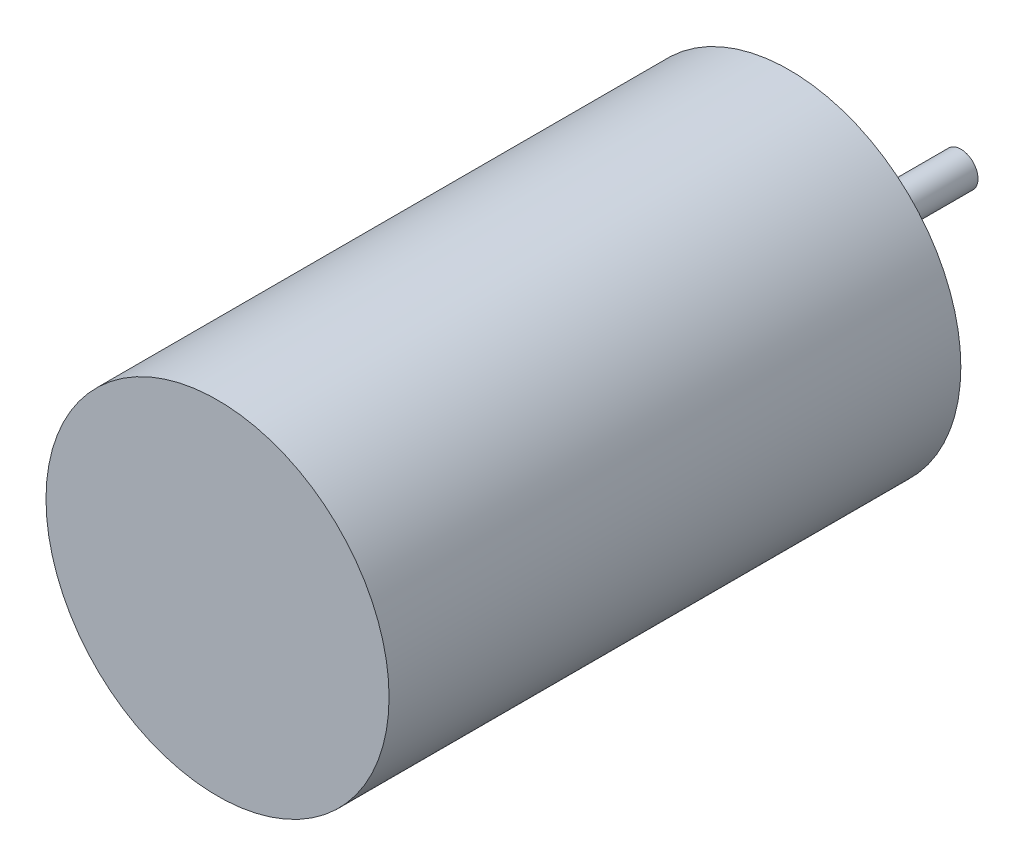
ISO-10303-21;
HEADER;
FILE_DESCRIPTION(('STEP AP214'),'2;1');
FILE_NAME('part.step','',(''),(''),'','','');
FILE_SCHEMA(('AUTOMOTIVE_DESIGN { 1 0 10303 214 1 1 1 1 }'));
ENDSEC;
DATA;
#1=APPLICATION_CONTEXT('core data for automotive mechanical design processes');
#2=APPLICATION_PROTOCOL_DEFINITION('international standard','automotive_design',2000,#1);
#3=PRODUCT_CONTEXT('',#1,'mechanical');
#4=PRODUCT('Part','Part','',(#3));
#5=PRODUCT_RELATED_PRODUCT_CATEGORY('part','',(#4));
#6=PRODUCT_DEFINITION_FORMATION('','',#4);
#7=PRODUCT_DEFINITION_CONTEXT('part definition',#1,'design');
#8=PRODUCT_DEFINITION('design','',#6,#7);
#9=PRODUCT_DEFINITION_SHAPE('','',#8);
#10=(LENGTH_UNIT() NAMED_UNIT(*) SI_UNIT(.MILLI.,.METRE.));
#11=(NAMED_UNIT(*) PLANE_ANGLE_UNIT() SI_UNIT($,.RADIAN.));
#12=(NAMED_UNIT(*) SI_UNIT($,.STERADIAN.) SOLID_ANGLE_UNIT());
#13=UNCERTAINTY_MEASURE_WITH_UNIT(LENGTH_MEASURE(1.E-05),#10,'distance_accuracy_value','');
#14=(GEOMETRIC_REPRESENTATION_CONTEXT(3) GLOBAL_UNCERTAINTY_ASSIGNED_CONTEXT((#13)) GLOBAL_UNIT_ASSIGNED_CONTEXT((#10,
#11,#12)) REPRESENTATION_CONTEXT('',''));
#15=CARTESIAN_POINT('',(0.,0.,0.));
#16=DIRECTION('',(0.,0.,1.));
#17=DIRECTION('',(1.,0.,0.));
#18=AXIS2_PLACEMENT_3D('',#15,#16,#17);
#19=CARTESIAN_POINT('',(0.,0.,0.));
#20=DIRECTION('',(0.,0.,1.));
#21=DIRECTION('',(1.,0.,0.));
#22=AXIS2_PLACEMENT_3D('',#19,#20,#21);
#23=PLANE('',#22);
#24=CARTESIAN_POINT('',(0.,0.,0.));
#25=DIRECTION('',(0.,0.,1.));
#26=DIRECTION('',(1.,0.,0.));
#27=AXIS2_PLACEMENT_3D('',#24,#25,#26);
#28=CIRCLE('',#27,15.);
#29=CARTESIAN_POINT('',(15.,0.,0.));
#30=VERTEX_POINT('',#29);
#31=EDGE_CURVE('E44',#30,#30,#28,.T.);
#32=ORIENTED_EDGE('',*,*,#31,.F.);
#33=EDGE_LOOP('',(#32));
#34=FACE_BOUND('',#33,.T.);
#35=CARTESIAN_POINT('',(0.,0.,0.));
#36=DIRECTION('',(0.,0.,1.));
#37=DIRECTION('',(1.,0.,0.));
#38=AXIS2_PLACEMENT_3D('',#35,#36,#37);
#39=CIRCLE('',#38,1.5);
#40=CARTESIAN_POINT('',(1.5,0.,0.));
#41=VERTEX_POINT('',#40);
#42=EDGE_CURVE('E10',#41,#41,#39,.F.);
#43=ORIENTED_EDGE('',*,*,#42,.F.);
#44=EDGE_LOOP('',(#43));
#45=FACE_BOUND('',#44,.T.);
#46=ADVANCED_FACE('F33',(#34,#45),#23,.F.);
#47=CARTESIAN_POINT('',(0.,0.,50.));
#48=DIRECTION('',(0.,0.,-1.));
#49=DIRECTION('',(-1.,0.,0.));
#50=AXIS2_PLACEMENT_3D('',#47,#48,#49);
#51=CYLINDRICAL_SURFACE('',#50,15.);
#52=CARTESIAN_POINT('',(0.,0.,50.));
#53=DIRECTION('',(0.,0.,1.));
#54=DIRECTION('',(1.,0.,0.));
#55=AXIS2_PLACEMENT_3D('',#52,#53,#54);
#56=CIRCLE('',#55,15.);
#57=CARTESIAN_POINT('',(15.,0.,50.));
#58=VERTEX_POINT('',#57);
#59=EDGE_CURVE('E40',#58,#58,#56,.T.);
#60=ORIENTED_EDGE('',*,*,#59,.F.);
#61=EDGE_LOOP('',(#60));
#62=FACE_BOUND('',#61,.T.);
#63=ORIENTED_EDGE('',*,*,#31,.T.);
#64=EDGE_LOOP('',(#63));
#65=FACE_BOUND('',#64,.T.);
#66=ADVANCED_FACE('F35',(#62,#65),#51,.T.);
#67=CARTESIAN_POINT('',(0.,0.,50.));
#68=DIRECTION('',(0.,0.,1.));
#69=DIRECTION('',(1.,0.,0.));
#70=AXIS2_PLACEMENT_3D('',#67,#68,#69);
#71=PLANE('',#70);
#72=ORIENTED_EDGE('',*,*,#59,.T.);
#73=EDGE_LOOP('',(#72));
#74=FACE_BOUND('',#73,.T.);
#75=ADVANCED_FACE('F58',(#74),#71,.T.);
#76=CARTESIAN_POINT('',(0.,0.,-15.));
#77=DIRECTION('',(0.,0.,1.));
#78=DIRECTION('',(1.,0.,0.));
#79=AXIS2_PLACEMENT_3D('',#76,#77,#78);
#80=CYLINDRICAL_SURFACE('',#79,1.5);
#81=CARTESIAN_POINT('',(0.,0.,-15.));
#82=DIRECTION('',(0.,0.,-1.));
#83=DIRECTION('',(-1.,0.,0.));
#84=AXIS2_PLACEMENT_3D('',#81,#82,#83);
#85=CIRCLE('',#84,1.5);
#86=CARTESIAN_POINT('',(-1.5,0.,-15.));
#87=VERTEX_POINT('',#86);
#88=EDGE_CURVE('E49',#87,#87,#85,.T.);
#89=ORIENTED_EDGE('',*,*,#88,.F.);
#90=EDGE_LOOP('',(#89));
#91=FACE_BOUND('',#90,.T.);
#92=ORIENTED_EDGE('',*,*,#42,.T.);
#93=EDGE_LOOP('',(#92));
#94=FACE_BOUND('',#93,.T.);
#95=ADVANCED_FACE('F56',(#91,#94),#80,.T.);
#96=CARTESIAN_POINT('',(0.,0.,-15.));
#97=DIRECTION('',(0.,0.,-1.));
#98=DIRECTION('',(-1.,0.,0.));
#99=AXIS2_PLACEMENT_3D('',#96,#97,#98);
#100=PLANE('',#99);
#101=ORIENTED_EDGE('',*,*,#88,.T.);
#102=EDGE_LOOP('',(#101));
#103=FACE_BOUND('',#102,.T.);
#104=ADVANCED_FACE('F54',(#103),#100,.T.);
#105=CLOSED_SHELL('',(#46,#66,#75,#95,#104));
#106=MANIFOLD_SOLID_BREP('B2',#105);
#107=ADVANCED_BREP_SHAPE_REPRESENTATION('',(#18,#106),#14);
#108=SHAPE_DEFINITION_REPRESENTATION(#9,#107);
ENDSEC;
END-ISO-10303-21;
